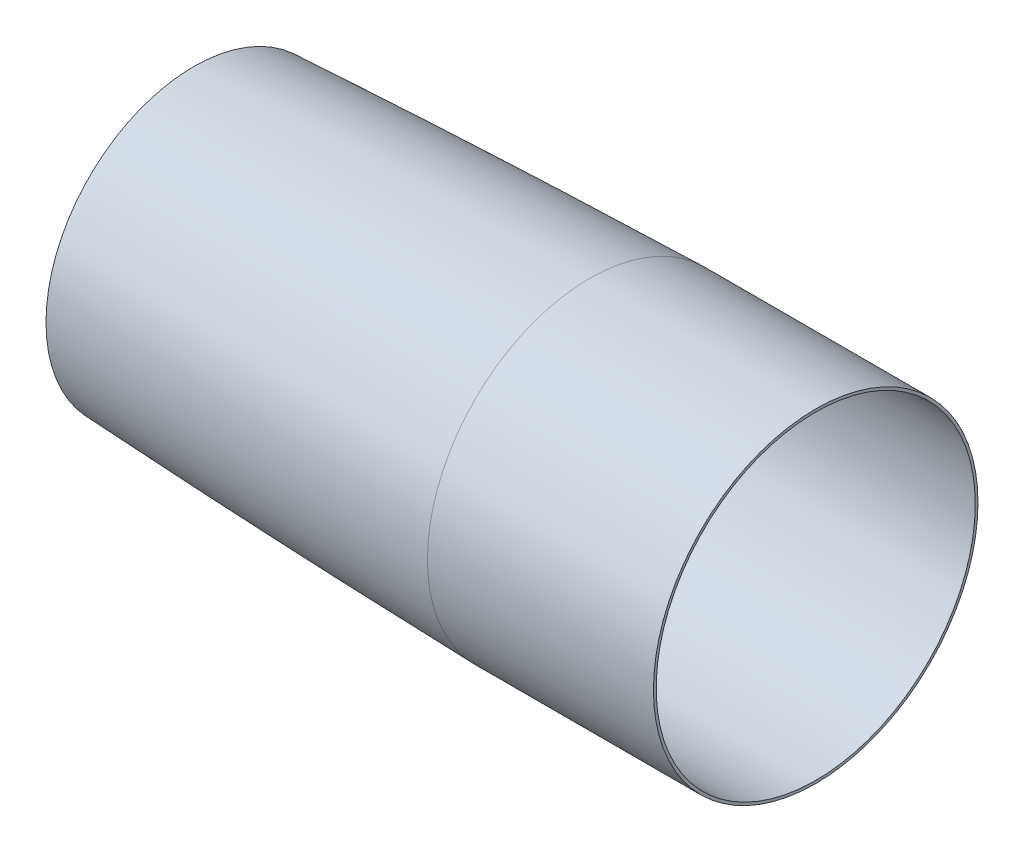
ISO-10303-21;
HEADER;
FILE_DESCRIPTION(('STEP AP214'),'2;1');
FILE_NAME('part.step','',(''),(''),'','','');
FILE_SCHEMA(('AUTOMOTIVE_DESIGN { 1 0 10303 214 1 1 1 1 }'));
ENDSEC;
DATA;
#1=APPLICATION_CONTEXT('core data for automotive mechanical design processes');
#2=APPLICATION_PROTOCOL_DEFINITION('international standard','automotive_design',2000,#1);
#3=PRODUCT_CONTEXT('',#1,'mechanical');
#4=PRODUCT('Part','Part','',(#3));
#5=PRODUCT_RELATED_PRODUCT_CATEGORY('part','',(#4));
#6=PRODUCT_DEFINITION_FORMATION('','',#4);
#7=PRODUCT_DEFINITION_CONTEXT('part definition',#1,'design');
#8=PRODUCT_DEFINITION('design','',#6,#7);
#9=PRODUCT_DEFINITION_SHAPE('','',#8);
#10=(LENGTH_UNIT() NAMED_UNIT(*) SI_UNIT(.MILLI.,.METRE.));
#11=(NAMED_UNIT(*) PLANE_ANGLE_UNIT() SI_UNIT($,.RADIAN.));
#12=(NAMED_UNIT(*) SI_UNIT($,.STERADIAN.) SOLID_ANGLE_UNIT());
#13=UNCERTAINTY_MEASURE_WITH_UNIT(LENGTH_MEASURE(1.E-05),#10,'distance_accuracy_value','');
#14=(GEOMETRIC_REPRESENTATION_CONTEXT(3) GLOBAL_UNCERTAINTY_ASSIGNED_CONTEXT((#13)) GLOBAL_UNIT_ASSIGNED_CONTEXT((#10,
#11,#12)) REPRESENTATION_CONTEXT('',''));
#15=CARTESIAN_POINT('',(0.,0.,0.));
#16=DIRECTION('',(0.,0.,1.));
#17=DIRECTION('',(1.,0.,0.));
#18=AXIS2_PLACEMENT_3D('',#15,#16,#17);
#19=CARTESIAN_POINT('',(490.969999999371,0.,-48.604634375865));
#20=CARTESIAN_POINT('',(490.119892858344,0.,-48.5847482846766));
#21=CARTESIAN_POINT('',(488.446752276404,0.,-48.5449792527696));
#22=CARTESIAN_POINT('',(484.034218998264,0.,-48.4386072519408));
#23=CARTESIAN_POINT('',(479.399328001379,0.,-48.319565863411));
#24=CARTESIAN_POINT('',(472.357001172344,0.,-48.1337155897235));
#25=CARTESIAN_POINT('',(465.238649857361,0.,-47.9306600222779));
#26=CARTESIAN_POINT('',(456.867103280533,0.,-47.6804685510604));
#27=CARTESIAN_POINT('',(448.841258040119,0.,-47.4236668040352));
#28=CARTESIAN_POINT('',(440.615801079767,0.,-47.1478170174245));
#29=CARTESIAN_POINT('',(432.504772066554,0.,-46.8597942313086));
#30=CARTESIAN_POINT('',(424.336059227359,0.,-46.5563259220608));
#31=CARTESIAN_POINT('',(416.18505040947,0.,-46.2378502182771));
#32=CARTESIAN_POINT('',(408.312195722236,0.,-45.9170408200304));
#33=CARTESIAN_POINT('',(401.393886451179,0.,-45.6221645826829));
#34=CARTESIAN_POINT('',(395.609288847812,0.,-45.3682295203501));
#35=CARTESIAN_POINT('',(390.662627743165,0.,-45.1444199013756));
#36=CARTESIAN_POINT('',(386.79354506656,0.,-44.9670494702777));
#37=CARTESIAN_POINT('',(382.338661841336,0.,-44.7567288743905));
#38=CARTESIAN_POINT('',(378.947512637155,0.,-44.5955967438201));
#39=CARTESIAN_POINT('',(374.969132916771,0.,-44.4005017631366));
#40=CARTESIAN_POINT('',(373.249289150177,0.,-44.315565849243));
#41=CARTESIAN_POINT('',(372.152909939176,0.,-44.2610160555843));
#42=CARTESIAN_POINT('',(371.905819878978,0.,-44.2487222144902));
#43=CARTESIAN_POINT('',(371.658729818779,0.,-44.2364283733961));
#44=CARTESIAN_POINT('',(371.411639758581,0.,-44.224134532302));
#45=B_SPLINE_CURVE_WITH_KNOTS('',4,(#19,#20,#21,#22,#23,#24,#25,#26,#27,#28,#29,#30,#31,#32,#33,
#34,#35,#36,#37,#38,#39,#40,#41,#42,#43,#44),.UNSPECIFIED.,.F.,.F.,(5,1,1,1,1,1,1,1,1,1,1,1,1,1,
1,1,1,1,1,3,5),(0.0826180841499274,0.111284648279209,0.139951212523374,0.178524604195199,
0.235857732632319,0.293190861159474,0.350523989581994,0.407857118094851,0.465190246545264,
0.52252337501133,0.57985650353173,0.637189631941327,0.694522760477145,0.744636551922339,
0.773303116118229,0.801969680273309,0.830636244692957,0.859302808791945,0.887969372996675,
0.916635937480929,0.924976116014239),.UNSPECIFIED.);
#46=CARTESIAN_POINT('',(558.670000000088,0.,-5.13478148889135E-13));
#47=DIRECTION('',(1.,0.,0.));
#48=AXIS1_PLACEMENT('',#46,#47);
#49=SURFACE_OF_REVOLUTION('',#45,#48);
#50=OFFSET_SURFACE('',#49,1.64,.F.);
#51=CARTESIAN_POINT('',(372.400000001002,0.,0.));
#52=DIRECTION('',(1.,0.,0.));
#53=DIRECTION('',(0.,0.,-1.));
#54=AXIS2_PLACEMENT_3D('',#51,#52,#53);
#55=CIRCLE('',#54,42.631281233487);
#56=CARTESIAN_POINT('',(372.400000001002,0.,-42.631281233487));
#57=VERTEX_POINT('',#56);
#58=EDGE_CURVE('E63',#57,#57,#55,.T.);
#59=ORIENTED_EDGE('',*,*,#58,.F.);
#60=EDGE_LOOP('',(#59));
#61=FACE_BOUND('',#60,.T.);
#62=CARTESIAN_POINT('',(490.970000000088,0.,-3.27153824594594E-13));
#63=DIRECTION('',(1.,0.,0.));
#64=DIRECTION('',(0.,0.,-1.));
#65=AXIS2_PLACEMENT_3D('',#62,#63,#64);
#66=CIRCLE('',#65,46.9641854869023);
#67=CARTESIAN_POINT('',(490.970000000088,0.,-46.9641854869026));
#68=VERTEX_POINT('',#67);
#69=EDGE_CURVE('E47',#68,#68,#66,.F.);
#70=ORIENTED_EDGE('',*,*,#69,.F.);
#71=EDGE_LOOP('',(#70));
#72=FACE_BOUND('',#71,.T.);
#73=ADVANCED_FACE('F43',(#61,#72),#50,.T.);
#74=CARTESIAN_POINT('',(490.969999999371,0.,-48.604634375865));
#75=CARTESIAN_POINT('',(490.119892858344,0.,-48.5847482846766));
#76=CARTESIAN_POINT('',(488.446752276404,0.,-48.5449792527696));
#77=CARTESIAN_POINT('',(484.034218998264,0.,-48.4386072519408));
#78=CARTESIAN_POINT('',(479.399328001379,0.,-48.319565863411));
#79=CARTESIAN_POINT('',(472.357001172344,0.,-48.1337155897235));
#80=CARTESIAN_POINT('',(465.238649857361,0.,-47.9306600222779));
#81=CARTESIAN_POINT('',(456.867103280533,0.,-47.6804685510604));
#82=CARTESIAN_POINT('',(448.841258040119,0.,-47.4236668040352));
#83=CARTESIAN_POINT('',(440.615801079767,0.,-47.1478170174245));
#84=CARTESIAN_POINT('',(432.504772066554,0.,-46.8597942313086));
#85=CARTESIAN_POINT('',(424.336059227359,0.,-46.5563259220608));
#86=CARTESIAN_POINT('',(416.18505040947,0.,-46.2378502182771));
#87=CARTESIAN_POINT('',(408.312195722236,0.,-45.9170408200304));
#88=CARTESIAN_POINT('',(401.393886451179,0.,-45.6221645826829));
#89=CARTESIAN_POINT('',(395.609288847812,0.,-45.3682295203501));
#90=CARTESIAN_POINT('',(390.662627743165,0.,-45.1444199013756));
#91=CARTESIAN_POINT('',(386.79354506656,0.,-44.9670494702777));
#92=CARTESIAN_POINT('',(382.338661841336,0.,-44.7567288743905));
#93=CARTESIAN_POINT('',(378.947512637155,0.,-44.5955967438201));
#94=CARTESIAN_POINT('',(374.969132916771,0.,-44.4005017631366));
#95=CARTESIAN_POINT('',(373.249289150177,0.,-44.315565849243));
#96=CARTESIAN_POINT('',(372.399999999375,0.,-44.2733098966785));
#97=CARTESIAN_POINT('',(372.152909939176,0.,-44.2610160555843));
#98=CARTESIAN_POINT('',(371.905819878978,0.,-44.2487222144902));
#99=CARTESIAN_POINT('',(371.658729818779,0.,-44.2364283733961));
#100=CARTESIAN_POINT('',(371.411639758581,0.,-44.224134532302));
#101=B_SPLINE_CURVE_WITH_KNOTS('',4,(#74,#75,#76,#77,#78,#79,#80,#81,#82,#83,#84,#85,#86,#87,
#88,#89,#90,#91,#92,#93,#94,#95,#96,#97,#98,#99,#100),.UNSPECIFIED.,.F.,.F.,(5,1,1,1,1,1,1,1,1,
1,1,1,1,1,1,1,1,1,1,4,5),(0.0826180841499274,0.111284648279209,0.139951212523374,
0.178524604195199,0.235857732632319,0.293190861159474,0.350523989581994,0.407857118094851,
0.465190246545264,0.52252337501133,0.57985650353173,0.637189631941327,0.694522760477145,
0.744636551922339,0.773303116118229,0.801969680273309,0.830636244692957,0.859302808791945,
0.887969372996675,0.916635937480929,0.924976116014239),.UNSPECIFIED.);
#102=CARTESIAN_POINT('',(558.670000000088,0.,-5.13478148889135E-13));
#103=DIRECTION('',(1.,0.,0.));
#104=AXIS1_PLACEMENT('',#102,#103);
#105=SURFACE_OF_REVOLUTION('',#101,#104);
#106=CARTESIAN_POINT('',(372.400000001002,0.,0.));
#107=DIRECTION('',(1.,0.,0.));
#108=DIRECTION('',(0.,0.,-1.));
#109=AXIS2_PLACEMENT_3D('',#106,#107,#108);
#110=CIRCLE('',#109,44.2733098967594);
#111=CARTESIAN_POINT('',(372.400000001002,0.,-44.2733098967594));
#112=VERTEX_POINT('',#111);
#113=EDGE_CURVE('E10',#112,#112,#110,.T.);
#114=ORIENTED_EDGE('',*,*,#113,.T.);
#115=EDGE_LOOP('',(#114));
#116=FACE_BOUND('',#115,.T.);
#117=CARTESIAN_POINT('',(490.970000001,0.,-3.27153824597104E-13));
#118=DIRECTION('',(1.,0.,0.));
#119=DIRECTION('',(0.,0.,-1.));
#120=AXIS2_PLACEMENT_3D('',#117,#118,#119);
#121=CIRCLE('',#120,48.6046343759043);
#122=CARTESIAN_POINT('',(490.970000001,0.,-48.6046343759046));
#123=VERTEX_POINT('',#122);
#124=EDGE_CURVE('E57',#123,#123,#121,.T.);
#125=ORIENTED_EDGE('',*,*,#124,.F.);
#126=EDGE_LOOP('',(#125));
#127=FACE_BOUND('',#126,.T.);
#128=ADVANCED_FACE('F73',(#116,#127),#105,.F.);
#129=CARTESIAN_POINT('',(372.400000001002,0.,0.));
#130=DIRECTION('',(-1.,0.,0.));
#131=DIRECTION('',(0.,0.,1.));
#132=AXIS2_PLACEMENT_3D('',#129,#130,#131);
#133=PLANE('',#132);
#134=ORIENTED_EDGE('',*,*,#58,.T.);
#135=EDGE_LOOP('',(#134));
#136=FACE_BOUND('',#135,.T.);
#137=ORIENTED_EDGE('',*,*,#113,.F.);
#138=EDGE_LOOP('',(#137));
#139=FACE_BOUND('',#138,.T.);
#140=ADVANCED_FACE('F45',(#136,#139),#133,.T.);
#141=CARTESIAN_POINT('',(558.670000000087,0.,-48.6046343759046));
#142=DIRECTION('',(1.,0.,0.));
#143=DIRECTION('',(0.,0.,-1.));
#144=AXIS2_PLACEMENT_3D('',#141,#142,#143);
#145=PLANE('',#144);
#146=CARTESIAN_POINT('',(558.670000000088,0.,-1.53757474525329E-12));
#147=DIRECTION('',(1.,0.,0.));
#148=DIRECTION('',(0.,0.,-1.));
#149=AXIS2_PLACEMENT_3D('',#146,#147,#148);
#150=CIRCLE('',#149,47.7846344);
#151=CARTESIAN_POINT('',(558.670000000087,0.,-47.7846344000015));
#152=VERTEX_POINT('',#151);
#153=EDGE_CURVE('E108',#152,#152,#150,.T.);
#154=ORIENTED_EDGE('',*,*,#153,.F.);
#155=EDGE_LOOP('',(#154));
#156=FACE_BOUND('',#155,.T.);
#157=CARTESIAN_POINT('',(558.670000000088,0.,-5.13478148889135E-13));
#158=DIRECTION('',(1.,0.,0.));
#159=DIRECTION('',(0.,0.,-1.));
#160=AXIS2_PLACEMENT_3D('',#157,#158,#159);
#161=CIRCLE('',#160,48.6046343759041);
#162=CARTESIAN_POINT('',(558.670000000088,0.,-48.6046343759046));
#163=VERTEX_POINT('',#162);
#164=EDGE_CURVE('E52',#163,#163,#161,.T.);
#165=ORIENTED_EDGE('',*,*,#164,.T.);
#166=EDGE_LOOP('',(#165));
#167=FACE_BOUND('',#166,.T.);
#168=ADVANCED_FACE('F82',(#156,#167),#145,.T.);
#169=CARTESIAN_POINT('',(558.670000000088,0.,-5.13478148889135E-13));
#170=DIRECTION('',(1.,0.,0.));
#171=DIRECTION('',(0.,0.,-1.));
#172=AXIS2_PLACEMENT_3D('',#169,#170,#171);
#173=CYLINDRICAL_SURFACE('',#172,48.6046343759042);
#174=ORIENTED_EDGE('',*,*,#124,.T.);
#175=EDGE_LOOP('',(#174));
#176=FACE_BOUND('',#175,.T.);
#177=ORIENTED_EDGE('',*,*,#164,.F.);
#178=EDGE_LOOP('',(#177));
#179=FACE_BOUND('',#178,.T.);
#180=ADVANCED_FACE('F79',(#176,#179),#173,.T.);
#181=CARTESIAN_POINT('',(490.970000000088,0.,-1.35125042095875E-12));
#182=DIRECTION('',(1.,0.,0.));
#183=DIRECTION('',(0.,0.,-1.));
#184=AXIS2_PLACEMENT_3D('',#181,#182,#183);
#185=PLANE('',#184);
#186=CARTESIAN_POINT('',(490.970000000088,0.,-1.35125042095875E-12));
#187=DIRECTION('',(1.,0.,0.));
#188=DIRECTION('',(0.,0.,-1.));
#189=AXIS2_PLACEMENT_3D('',#186,#187,#188);
#190=CIRCLE('',#189,47.7846344);
#191=CARTESIAN_POINT('',(490.970000000088,0.,-47.7846344000014));
#192=VERTEX_POINT('',#191);
#193=EDGE_CURVE('E104',#192,#192,#190,.T.);
#194=ORIENTED_EDGE('',*,*,#193,.T.);
#195=EDGE_LOOP('',(#194));
#196=FACE_BOUND('',#195,.T.);
#197=ORIENTED_EDGE('',*,*,#69,.T.);
#198=EDGE_LOOP('',(#197));
#199=FACE_BOUND('',#198,.T.);
#200=ADVANCED_FACE('F81',(#196,#199),#185,.T.);
#201=CARTESIAN_POINT('',(490.970000000088,0.,-1.35125042095875E-12));
#202=DIRECTION('',(1.,0.,0.));
#203=DIRECTION('',(0.,0.,-1.));
#204=AXIS2_PLACEMENT_3D('',#201,#202,#203);
#205=CYLINDRICAL_SURFACE('',#204,47.7846344);
#206=ORIENTED_EDGE('',*,*,#193,.F.);
#207=EDGE_LOOP('',(#206));
#208=FACE_BOUND('',#207,.T.);
#209=ORIENTED_EDGE('',*,*,#153,.T.);
#210=EDGE_LOOP('',(#209));
#211=FACE_BOUND('',#210,.T.);
#212=ADVANCED_FACE('F115',(#208,#211),#205,.F.);
#213=CLOSED_SHELL('',(#73,#128,#140,#168,#180,#200,#212));
#214=MANIFOLD_SOLID_BREP('B2',#213);
#215=ADVANCED_BREP_SHAPE_REPRESENTATION('',(#18,#214),#14);
#216=SHAPE_DEFINITION_REPRESENTATION(#9,#215);
ENDSEC;
END-ISO-10303-21;
